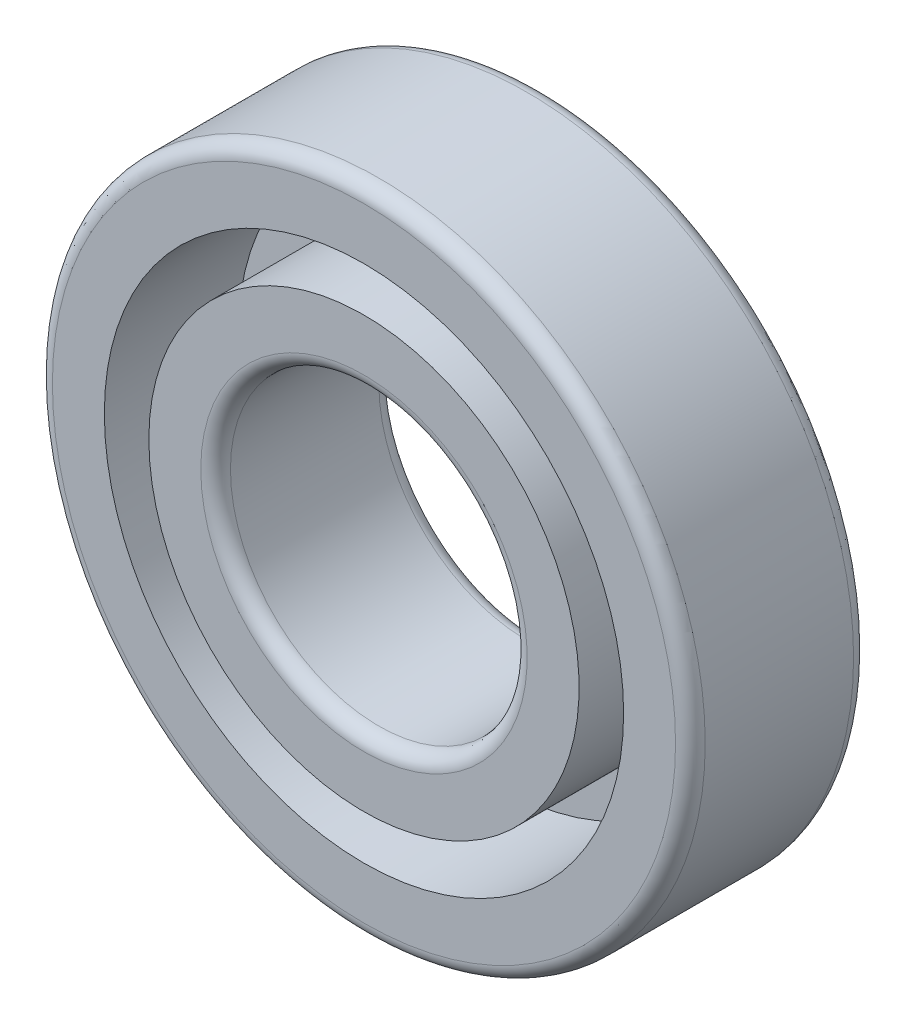
ISO-10303-21;
HEADER;
FILE_DESCRIPTION(('STEP AP214'),'2;1');
FILE_NAME('part.step','',(''),(''),'','','');
FILE_SCHEMA(('AUTOMOTIVE_DESIGN { 1 0 10303 214 1 1 1 1 }'));
ENDSEC;
DATA;
#1=APPLICATION_CONTEXT('core data for automotive mechanical design processes');
#2=APPLICATION_PROTOCOL_DEFINITION('international standard','automotive_design',2000,#1);
#3=PRODUCT_CONTEXT('',#1,'mechanical');
#4=PRODUCT('Part','Part','',(#3));
#5=PRODUCT_RELATED_PRODUCT_CATEGORY('part','',(#4));
#6=PRODUCT_DEFINITION_FORMATION('','',#4);
#7=PRODUCT_DEFINITION_CONTEXT('part definition',#1,'design');
#8=PRODUCT_DEFINITION('design','',#6,#7);
#9=PRODUCT_DEFINITION_SHAPE('','',#8);
#10=(LENGTH_UNIT() NAMED_UNIT(*) SI_UNIT(.MILLI.,.METRE.));
#11=(NAMED_UNIT(*) PLANE_ANGLE_UNIT() SI_UNIT($,.RADIAN.));
#12=(NAMED_UNIT(*) SI_UNIT($,.STERADIAN.) SOLID_ANGLE_UNIT());
#13=UNCERTAINTY_MEASURE_WITH_UNIT(LENGTH_MEASURE(1.E-05),#10,'distance_accuracy_value','');
#14=(GEOMETRIC_REPRESENTATION_CONTEXT(3) GLOBAL_UNCERTAINTY_ASSIGNED_CONTEXT((#13)) GLOBAL_UNIT_ASSIGNED_CONTEXT((#10,
#11,#12)) REPRESENTATION_CONTEXT('',''));
#15=CARTESIAN_POINT('',(0.,0.,0.));
#16=DIRECTION('',(0.,0.,1.));
#17=DIRECTION('',(1.,0.,0.));
#18=AXIS2_PLACEMENT_3D('',#15,#16,#17);
#19=CARTESIAN_POINT('',(0.,21.9999999995122,2.5));
#20=DIRECTION('',(0.,0.,-1.));
#21=DIRECTION('',(-1.,0.,0.));
#22=AXIS2_PLACEMENT_3D('',#19,#20,#21);
#23=TOROIDAL_SURFACE('',#22,5.5,0.5);
#24=CARTESIAN_POINT('',(0.,21.9999999995122,2.5));
#25=DIRECTION('',(0.,0.,-1.));
#26=DIRECTION('',(-1.,0.,0.));
#27=AXIS2_PLACEMENT_3D('',#24,#25,#26);
#28=CIRCLE('',#27,5.);
#29=CARTESIAN_POINT('',(-5.,21.9999999995122,2.5));
#30=VERTEX_POINT('',#29);
#31=EDGE_CURVE('E10',#30,#30,#28,.T.);
#32=ORIENTED_EDGE('',*,*,#31,.T.);
#33=EDGE_LOOP('',(#32));
#34=FACE_BOUND('',#33,.T.);
#35=CARTESIAN_POINT('',(0.,21.9999999995122,3.));
#36=DIRECTION('',(0.,0.,-1.));
#37=DIRECTION('',(-1.,0.,0.));
#38=AXIS2_PLACEMENT_3D('',#35,#36,#37);
#39=CIRCLE('',#38,5.5);
#40=CARTESIAN_POINT('',(-5.5,21.9999999995122,3.));
#41=VERTEX_POINT('',#40);
#42=EDGE_CURVE('E72',#41,#41,#39,.T.);
#43=ORIENTED_EDGE('',*,*,#42,.F.);
#44=EDGE_LOOP('',(#43));
#45=FACE_BOUND('',#44,.T.);
#46=ADVANCED_FACE('F32',(#34,#45),#23,.T.);
#47=CARTESIAN_POINT('',(0.,21.9999999995122,3.));
#48=DIRECTION('',(0.,0.,-1.));
#49=DIRECTION('',(-1.,0.,0.));
#50=AXIS2_PLACEMENT_3D('',#47,#48,#49);
#51=CYLINDRICAL_SURFACE('',#50,5.);
#52=CARTESIAN_POINT('',(0.,21.9999999995122,-2.5));
#53=DIRECTION('',(0.,0.,-1.));
#54=DIRECTION('',(-1.,0.,0.));
#55=AXIS2_PLACEMENT_3D('',#52,#53,#54);
#56=CIRCLE('',#55,5.);
#57=CARTESIAN_POINT('',(-5.,21.9999999995122,-2.5));
#58=VERTEX_POINT('',#57);
#59=EDGE_CURVE('E38',#58,#58,#56,.T.);
#60=ORIENTED_EDGE('',*,*,#59,.T.);
#61=EDGE_LOOP('',(#60));
#62=FACE_BOUND('',#61,.T.);
#63=ORIENTED_EDGE('',*,*,#31,.F.);
#64=EDGE_LOOP('',(#63));
#65=FACE_BOUND('',#64,.T.);
#66=ADVANCED_FACE('F80',(#62,#65),#51,.F.);
#67=CARTESIAN_POINT('',(0.,21.9999999995122,-2.5));
#68=DIRECTION('',(0.,0.,-1.));
#69=DIRECTION('',(-1.,0.,0.));
#70=AXIS2_PLACEMENT_3D('',#67,#68,#69);
#71=TOROIDAL_SURFACE('',#70,5.5,0.5);
#72=CARTESIAN_POINT('',(0.,21.9999999995122,-3.));
#73=DIRECTION('',(0.,0.,-1.));
#74=DIRECTION('',(-1.,0.,0.));
#75=AXIS2_PLACEMENT_3D('',#72,#73,#74);
#76=CIRCLE('',#75,5.5);
#77=CARTESIAN_POINT('',(-5.5,21.9999999995122,-3.));
#78=VERTEX_POINT('',#77);
#79=EDGE_CURVE('E42',#78,#78,#76,.T.);
#80=ORIENTED_EDGE('',*,*,#79,.T.);
#81=EDGE_LOOP('',(#80));
#82=FACE_BOUND('',#81,.T.);
#83=ORIENTED_EDGE('',*,*,#59,.F.);
#84=EDGE_LOOP('',(#83));
#85=FACE_BOUND('',#84,.T.);
#86=ADVANCED_FACE('F84',(#82,#85),#71,.T.);
#87=CARTESIAN_POINT('',(5.5,21.9999999995122,-3.));
#88=DIRECTION('',(0.,0.,-1.));
#89=DIRECTION('',(-1.,0.,0.));
#90=AXIS2_PLACEMENT_3D('',#87,#88,#89);
#91=PLANE('',#90);
#92=CARTESIAN_POINT('',(0.,21.9999999995122,-3.));
#93=DIRECTION('',(0.,0.,-1.));
#94=DIRECTION('',(-1.,0.,0.));
#95=AXIS2_PLACEMENT_3D('',#92,#93,#94);
#96=CIRCLE('',#95,10.5);
#97=CARTESIAN_POINT('',(-10.5,21.9999999995122,-3.));
#98=VERTEX_POINT('',#97);
#99=EDGE_CURVE('E46',#98,#98,#96,.T.);
#100=ORIENTED_EDGE('',*,*,#99,.T.);
#101=EDGE_LOOP('',(#100));
#102=FACE_BOUND('',#101,.T.);
#103=ORIENTED_EDGE('',*,*,#79,.F.);
#104=EDGE_LOOP('',(#103));
#105=FACE_BOUND('',#104,.T.);
#106=ADVANCED_FACE('F88',(#102,#105),#91,.T.);
#107=CARTESIAN_POINT('',(0.,21.9999999995122,-2.5));
#108=DIRECTION('',(0.,0.,-1.));
#109=DIRECTION('',(-1.,0.,0.));
#110=AXIS2_PLACEMENT_3D('',#107,#108,#109);
#111=TOROIDAL_SURFACE('',#110,10.5,0.5);
#112=CARTESIAN_POINT('',(0.,21.9999999995122,-2.5));
#113=DIRECTION('',(0.,0.,-1.));
#114=DIRECTION('',(-1.,0.,0.));
#115=AXIS2_PLACEMENT_3D('',#112,#113,#114);
#116=CIRCLE('',#115,11.);
#117=CARTESIAN_POINT('',(-11.,21.9999999995122,-2.5));
#118=VERTEX_POINT('',#117);
#119=EDGE_CURVE('E51',#118,#118,#116,.T.);
#120=ORIENTED_EDGE('',*,*,#119,.T.);
#121=EDGE_LOOP('',(#120));
#122=FACE_BOUND('',#121,.T.);
#123=ORIENTED_EDGE('',*,*,#99,.F.);
#124=EDGE_LOOP('',(#123));
#125=FACE_BOUND('',#124,.T.);
#126=ADVANCED_FACE('F95',(#122,#125),#111,.T.);
#127=CARTESIAN_POINT('',(0.,21.9999999995122,3.));
#128=DIRECTION('',(0.,0.,-1.));
#129=DIRECTION('',(-1.,0.,0.));
#130=AXIS2_PLACEMENT_3D('',#127,#128,#129);
#131=CYLINDRICAL_SURFACE('',#130,11.);
#132=CARTESIAN_POINT('',(0.,21.9999999995122,2.5));
#133=DIRECTION('',(0.,0.,-1.));
#134=DIRECTION('',(-1.,0.,0.));
#135=AXIS2_PLACEMENT_3D('',#132,#133,#134);
#136=CIRCLE('',#135,11.);
#137=CARTESIAN_POINT('',(-11.,21.9999999995122,2.5));
#138=VERTEX_POINT('',#137);
#139=EDGE_CURVE('E54',#138,#138,#136,.T.);
#140=ORIENTED_EDGE('',*,*,#139,.T.);
#141=EDGE_LOOP('',(#140));
#142=FACE_BOUND('',#141,.T.);
#143=ORIENTED_EDGE('',*,*,#119,.F.);
#144=EDGE_LOOP('',(#143));
#145=FACE_BOUND('',#144,.T.);
#146=ADVANCED_FACE('F99',(#142,#145),#131,.T.);
#147=CARTESIAN_POINT('',(0.,21.9999999995122,2.5));
#148=DIRECTION('',(0.,0.,-1.));
#149=DIRECTION('',(-1.,0.,0.));
#150=AXIS2_PLACEMENT_3D('',#147,#148,#149);
#151=TOROIDAL_SURFACE('',#150,10.5,0.5);
#152=CARTESIAN_POINT('',(0.,21.9999999995122,3.));
#153=DIRECTION('',(0.,0.,-1.));
#154=DIRECTION('',(-1.,0.,0.));
#155=AXIS2_PLACEMENT_3D('',#152,#153,#154);
#156=CIRCLE('',#155,10.5);
#157=CARTESIAN_POINT('',(-10.5,21.9999999995122,3.));
#158=VERTEX_POINT('',#157);
#159=EDGE_CURVE('E57',#158,#158,#156,.T.);
#160=ORIENTED_EDGE('',*,*,#159,.T.);
#161=EDGE_LOOP('',(#160));
#162=FACE_BOUND('',#161,.T.);
#163=ORIENTED_EDGE('',*,*,#139,.F.);
#164=EDGE_LOOP('',(#163));
#165=FACE_BOUND('',#164,.T.);
#166=ADVANCED_FACE('F103',(#162,#165),#151,.T.);
#167=CARTESIAN_POINT('',(10.5,21.9999999995122,3.));
#168=DIRECTION('',(0.,0.,1.));
#169=DIRECTION('',(1.,0.,0.));
#170=AXIS2_PLACEMENT_3D('',#167,#168,#169);
#171=PLANE('',#170);
#172=CARTESIAN_POINT('',(0.,21.9999999995122,3.));
#173=DIRECTION('',(0.,0.,-1.));
#174=DIRECTION('',(-1.,0.,0.));
#175=AXIS2_PLACEMENT_3D('',#172,#173,#174);
#176=CIRCLE('',#175,8.75);
#177=CARTESIAN_POINT('',(-8.75,21.9999999995122,3.));
#178=VERTEX_POINT('',#177);
#179=EDGE_CURVE('E60',#178,#178,#176,.T.);
#180=ORIENTED_EDGE('',*,*,#179,.T.);
#181=EDGE_LOOP('',(#180));
#182=FACE_BOUND('',#181,.T.);
#183=ORIENTED_EDGE('',*,*,#159,.F.);
#184=EDGE_LOOP('',(#183));
#185=FACE_BOUND('',#184,.T.);
#186=ADVANCED_FACE('F107',(#182,#185),#171,.T.);
#187=CARTESIAN_POINT('',(0.,21.9999999995122,3.));
#188=DIRECTION('',(0.,0.,-1.));
#189=DIRECTION('',(-1.,0.,0.));
#190=AXIS2_PLACEMENT_3D('',#187,#188,#189);
#191=CYLINDRICAL_SURFACE('',#190,8.75);
#192=CARTESIAN_POINT('',(0.,21.9999999995122,-1.5));
#193=DIRECTION('',(0.,0.,-1.));
#194=DIRECTION('',(-1.,0.,0.));
#195=AXIS2_PLACEMENT_3D('',#192,#193,#194);
#196=CIRCLE('',#195,8.75);
#197=CARTESIAN_POINT('',(-8.75,21.9999999995122,-1.5));
#198=VERTEX_POINT('',#197);
#199=EDGE_CURVE('E63',#198,#198,#196,.T.);
#200=ORIENTED_EDGE('',*,*,#199,.T.);
#201=EDGE_LOOP('',(#200));
#202=FACE_BOUND('',#201,.T.);
#203=ORIENTED_EDGE('',*,*,#179,.F.);
#204=EDGE_LOOP('',(#203));
#205=FACE_BOUND('',#204,.T.);
#206=ADVANCED_FACE('F111',(#202,#205),#191,.F.);
#207=CARTESIAN_POINT('',(8.75,21.9999999995122,-1.5));
#208=DIRECTION('',(0.,0.,1.));
#209=DIRECTION('',(1.,0.,0.));
#210=AXIS2_PLACEMENT_3D('',#207,#208,#209);
#211=PLANE('',#210);
#212=CARTESIAN_POINT('',(0.,21.9999999995122,-1.5));
#213=DIRECTION('',(0.,0.,-1.));
#214=DIRECTION('',(-1.,0.,0.));
#215=AXIS2_PLACEMENT_3D('',#212,#213,#214);
#216=CIRCLE('',#215,7.25);
#217=CARTESIAN_POINT('',(-7.25,21.9999999995122,-1.5));
#218=VERTEX_POINT('',#217);
#219=EDGE_CURVE('E66',#218,#218,#216,.T.);
#220=ORIENTED_EDGE('',*,*,#219,.T.);
#221=EDGE_LOOP('',(#220));
#222=FACE_BOUND('',#221,.T.);
#223=ORIENTED_EDGE('',*,*,#199,.F.);
#224=EDGE_LOOP('',(#223));
#225=FACE_BOUND('',#224,.T.);
#226=ADVANCED_FACE('F115',(#222,#225),#211,.T.);
#227=CARTESIAN_POINT('',(0.,21.9999999995122,3.));
#228=DIRECTION('',(0.,0.,-1.));
#229=DIRECTION('',(-1.,0.,0.));
#230=AXIS2_PLACEMENT_3D('',#227,#228,#229);
#231=CYLINDRICAL_SURFACE('',#230,7.25);
#232=CARTESIAN_POINT('',(0.,21.9999999995122,3.));
#233=DIRECTION('',(0.,0.,-1.));
#234=DIRECTION('',(-1.,0.,0.));
#235=AXIS2_PLACEMENT_3D('',#232,#233,#234);
#236=CIRCLE('',#235,7.25);
#237=CARTESIAN_POINT('',(-7.25,21.9999999995122,3.));
#238=VERTEX_POINT('',#237);
#239=EDGE_CURVE('E69',#238,#238,#236,.T.);
#240=ORIENTED_EDGE('',*,*,#239,.T.);
#241=EDGE_LOOP('',(#240));
#242=FACE_BOUND('',#241,.T.);
#243=ORIENTED_EDGE('',*,*,#219,.F.);
#244=EDGE_LOOP('',(#243));
#245=FACE_BOUND('',#244,.T.);
#246=ADVANCED_FACE('F119',(#242,#245),#231,.T.);
#247=CARTESIAN_POINT('',(7.25,21.9999999995122,3.));
#248=DIRECTION('',(0.,0.,1.));
#249=DIRECTION('',(1.,0.,0.));
#250=AXIS2_PLACEMENT_3D('',#247,#248,#249);
#251=PLANE('',#250);
#252=ORIENTED_EDGE('',*,*,#42,.T.);
#253=EDGE_LOOP('',(#252));
#254=FACE_BOUND('',#253,.T.);
#255=ORIENTED_EDGE('',*,*,#239,.F.);
#256=EDGE_LOOP('',(#255));
#257=FACE_BOUND('',#256,.T.);
#258=ADVANCED_FACE('F76',(#254,#257),#251,.T.);
#259=CLOSED_SHELL('',(#46,#66,#86,#106,#126,#146,#166,#186,#206,#226,#246,#258));
#260=MANIFOLD_SOLID_BREP('B2',#259);
#261=ADVANCED_BREP_SHAPE_REPRESENTATION('',(#18,#260),#14);
#262=SHAPE_DEFINITION_REPRESENTATION(#9,#261);
ENDSEC;
END-ISO-10303-21;
